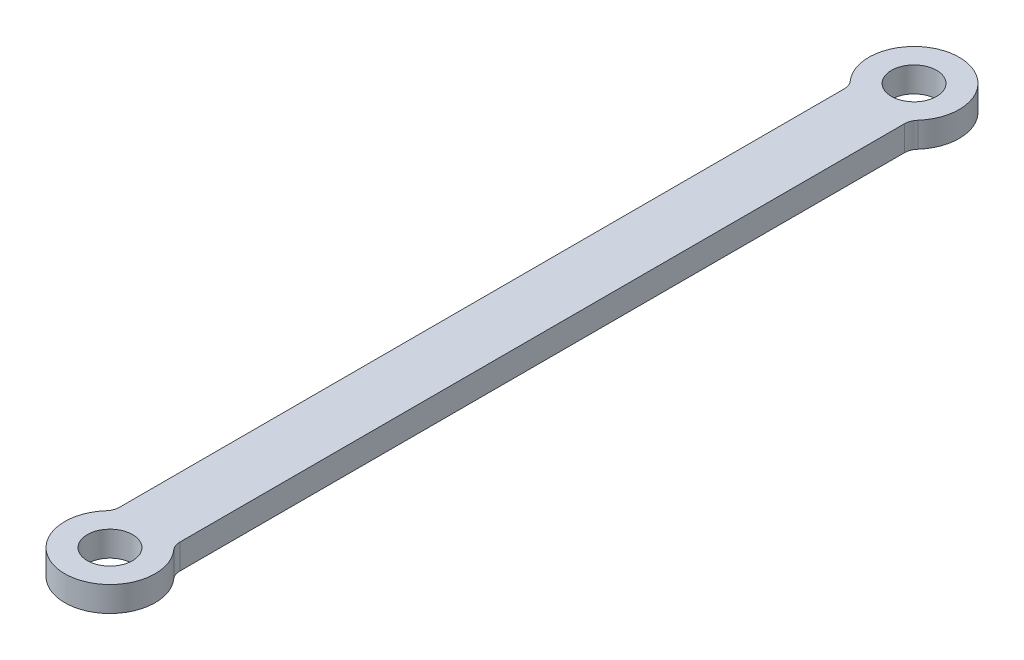
ISO-10303-21;
HEADER;
FILE_DESCRIPTION(('STEP AP214'),'2;1');
FILE_NAME('part.step','',(''),(''),'','','');
FILE_SCHEMA(('AUTOMOTIVE_DESIGN { 1 0 10303 214 1 1 1 1 }'));
ENDSEC;
DATA;
#1=APPLICATION_CONTEXT('core data for automotive mechanical design processes');
#2=APPLICATION_PROTOCOL_DEFINITION('international standard','automotive_design',2000,#1);
#3=PRODUCT_CONTEXT('',#1,'mechanical');
#4=PRODUCT('Part','Part','',(#3));
#5=PRODUCT_RELATED_PRODUCT_CATEGORY('part','',(#4));
#6=PRODUCT_DEFINITION_FORMATION('','',#4);
#7=PRODUCT_DEFINITION_CONTEXT('part definition',#1,'design');
#8=PRODUCT_DEFINITION('design','',#6,#7);
#9=PRODUCT_DEFINITION_SHAPE('','',#8);
#10=(LENGTH_UNIT() NAMED_UNIT(*) SI_UNIT(.MILLI.,.METRE.));
#11=(NAMED_UNIT(*) PLANE_ANGLE_UNIT() SI_UNIT($,.RADIAN.));
#12=(NAMED_UNIT(*) SI_UNIT($,.STERADIAN.) SOLID_ANGLE_UNIT());
#13=UNCERTAINTY_MEASURE_WITH_UNIT(LENGTH_MEASURE(1.E-05),#10,'distance_accuracy_value','');
#14=(GEOMETRIC_REPRESENTATION_CONTEXT(3) GLOBAL_UNCERTAINTY_ASSIGNED_CONTEXT((#13)) GLOBAL_UNIT_ASSIGNED_CONTEXT((#10,
#11,#12)) REPRESENTATION_CONTEXT('',''));
#15=CARTESIAN_POINT('',(0.,0.,0.));
#16=DIRECTION('',(0.,0.,1.));
#17=DIRECTION('',(1.,0.,0.));
#18=AXIS2_PLACEMENT_3D('',#15,#16,#17);
#19=CARTESIAN_POINT('',(-66.8897637795275,5.,106.393454728224));
#20=DIRECTION('',(0.,-1.,0.));
#21=DIRECTION('',(0.,0.,-1.));
#22=AXIS2_PLACEMENT_3D('',#19,#20,#21);
#23=PLANE('',#22);
#24=CARTESIAN_POINT('',(-66.8897637795275,5.,106.393454728224));
#25=DIRECTION('',(0.,-1.,0.));
#26=DIRECTION('',(0.,0.,-1.));
#27=AXIS2_PLACEMENT_3D('',#24,#25,#26);
#28=CIRCLE('',#27,3.);
#29=CARTESIAN_POINT('',(-69.1397637795275,5.,108.377768211522));
#30=VERTEX_POINT('',#29);
#31=CARTESIAN_POINT('',(-69.8897637795275,5.,106.393454728224));
#32=VERTEX_POINT('',#31);
#33=EDGE_CURVE('E164',#30,#32,#28,.T.);
#34=ORIENTED_EDGE('',*,*,#33,.T.);
#35=DIRECTION('',(0.,0.,-1.));
#36=VECTOR('',#35,1.);
#37=CARTESIAN_POINT('',(-69.8897637795275,5.,-37.7320374053889));
#38=LINE('',#37,#36);
#39=CARTESIAN_POINT('',(-69.8897637795275,5.,-37.7320374053889));
#40=VERTEX_POINT('',#39);
#41=EDGE_CURVE('E100',#32,#40,#38,.T.);
#42=ORIENTED_EDGE('',*,*,#41,.T.);
#43=CARTESIAN_POINT('',(-66.8897637795275,5.,-37.7320374053889));
#44=DIRECTION('',(0.,-1.,0.));
#45=DIRECTION('',(0.,0.,-1.));
#46=AXIS2_PLACEMENT_3D('',#43,#44,#45);
#47=CIRCLE('',#46,3.);
#48=CARTESIAN_POINT('',(-69.1397637795275,5.,-39.7163508886873));
#49=VERTEX_POINT('',#48);
#50=EDGE_CURVE('E185',#40,#49,#47,.T.);
#51=ORIENTED_EDGE('',*,*,#50,.T.);
#52=CARTESIAN_POINT('',(-75.8897637795275,5.,-45.6692913385827));
#53=DIRECTION('',(0.,1.,0.));
#54=DIRECTION('',(0.,0.,1.));
#55=AXIS2_PLACEMENT_3D('',#52,#53,#54);
#56=CIRCLE('',#55,8.99999999999999);
#57=CARTESIAN_POINT('',(-82.6397637795275,5.,-39.7163508886873));
#58=VERTEX_POINT('',#57);
#59=EDGE_CURVE('E199',#49,#58,#56,.T.);
#60=ORIENTED_EDGE('',*,*,#59,.T.);
#61=CARTESIAN_POINT('',(-84.8897637795275,5.,-37.7320374053888));
#62=DIRECTION('',(0.,-1.,0.));
#63=DIRECTION('',(0.,0.,1.));
#64=AXIS2_PLACEMENT_3D('',#61,#62,#63);
#65=CIRCLE('',#64,3.00000000000001);
#66=CARTESIAN_POINT('',(-81.8897637795275,5.,-37.7320374053888));
#67=VERTEX_POINT('',#66);
#68=EDGE_CURVE('E119',#58,#67,#65,.T.);
#69=ORIENTED_EDGE('',*,*,#68,.T.);
#70=DIRECTION('',(0.,0.,1.));
#71=VECTOR('',#70,1.);
#72=CARTESIAN_POINT('',(-81.8897637795275,5.,-37.7320374053888));
#73=LINE('',#72,#71);
#74=CARTESIAN_POINT('',(-81.8897637795259,5.,106.393454728222));
#75=VERTEX_POINT('',#74);
#76=EDGE_CURVE('E113',#67,#75,#73,.T.);
#77=ORIENTED_EDGE('',*,*,#76,.T.);
#78=CARTESIAN_POINT('',(-84.8897637795259,5.,106.393454728222));
#79=DIRECTION('',(0.,-1.,0.));
#80=DIRECTION('',(0.,0.,-1.));
#81=AXIS2_PLACEMENT_3D('',#78,#79,#80);
#82=CIRCLE('',#81,3.00000000000001);
#83=CARTESIAN_POINT('',(-82.6397637795263,5.,108.377768211521));
#84=VERTEX_POINT('',#83);
#85=EDGE_CURVE('E117',#75,#84,#82,.T.);
#86=ORIENTED_EDGE('',*,*,#85,.T.);
#87=CARTESIAN_POINT('',(-75.8897637795275,5.,114.330708661417));
#88=DIRECTION('',(0.,1.,0.));
#89=DIRECTION('',(0.,0.,1.));
#90=AXIS2_PLACEMENT_3D('',#87,#88,#89);
#91=CIRCLE('',#90,8.99999999999999);
#92=EDGE_CURVE('E57',#84,#30,#91,.T.);
#93=ORIENTED_EDGE('',*,*,#92,.T.);
#94=EDGE_LOOP('',(#34,#42,#51,#60,#69,#77,#86,#93));
#95=FACE_BOUND('',#94,.T.);
#96=CARTESIAN_POINT('',(-75.8897637795275,5.,-45.6692913385827));
#97=DIRECTION('',(0.,1.,0.));
#98=DIRECTION('',(0.,0.,1.));
#99=AXIS2_PLACEMENT_3D('',#96,#97,#98);
#100=CIRCLE('',#99,4.50000000000001);
#101=CARTESIAN_POINT('',(-75.8897637795275,5.,-41.1692913385827));
#102=VERTEX_POINT('',#101);
#103=EDGE_CURVE('E146',#102,#102,#100,.T.);
#104=ORIENTED_EDGE('',*,*,#103,.F.);
#105=EDGE_LOOP('',(#104));
#106=FACE_BOUND('',#105,.T.);
#107=CARTESIAN_POINT('',(-75.8897637795275,5.,114.330708661417));
#108=DIRECTION('',(0.,1.,0.));
#109=DIRECTION('',(0.,0.,1.));
#110=AXIS2_PLACEMENT_3D('',#107,#108,#109);
#111=CIRCLE('',#110,4.50000000000001);
#112=CARTESIAN_POINT('',(-75.8897637795275,5.,118.830708661417));
#113=VERTEX_POINT('',#112);
#114=EDGE_CURVE('E213',#113,#113,#111,.T.);
#115=ORIENTED_EDGE('',*,*,#114,.F.);
#116=EDGE_LOOP('',(#115));
#117=FACE_BOUND('',#116,.T.);
#118=ADVANCED_FACE('F39',(#95,#106,#117),#23,.F.);
#119=CARTESIAN_POINT('',(-66.8897637795275,0.,106.393454728224));
#120=DIRECTION('',(0.,-1.,0.));
#121=DIRECTION('',(0.,0.,-1.));
#122=AXIS2_PLACEMENT_3D('',#119,#120,#121);
#123=PLANE('',#122);
#124=CARTESIAN_POINT('',(-75.8897637795275,0.,-45.6692913385827));
#125=DIRECTION('',(0.,1.,0.));
#126=DIRECTION('',(0.,0.,1.));
#127=AXIS2_PLACEMENT_3D('',#124,#125,#126);
#128=CIRCLE('',#127,4.50000000000001);
#129=CARTESIAN_POINT('',(-75.8897637795275,0.,-41.1692913385827));
#130=VERTEX_POINT('',#129);
#131=EDGE_CURVE('E209',#130,#130,#128,.T.);
#132=ORIENTED_EDGE('',*,*,#131,.T.);
#133=EDGE_LOOP('',(#132));
#134=FACE_BOUND('',#133,.T.);
#135=CARTESIAN_POINT('',(-66.8897637795275,0.,106.393454728224));
#136=DIRECTION('',(0.,-1.,0.));
#137=DIRECTION('',(0.,0.,-1.));
#138=AXIS2_PLACEMENT_3D('',#135,#136,#137);
#139=CIRCLE('',#138,3.);
#140=CARTESIAN_POINT('',(-69.1397637795275,0.,108.377768211522));
#141=VERTEX_POINT('',#140);
#142=CARTESIAN_POINT('',(-69.8897637795275,0.,106.393454728224));
#143=VERTEX_POINT('',#142);
#144=EDGE_CURVE('E141',#141,#143,#139,.T.);
#145=ORIENTED_EDGE('',*,*,#144,.F.);
#146=CARTESIAN_POINT('',(-75.8897637795275,0.,114.330708661417));
#147=DIRECTION('',(0.,1.,0.));
#148=DIRECTION('',(0.,0.,1.));
#149=AXIS2_PLACEMENT_3D('',#146,#147,#148);
#150=CIRCLE('',#149,8.99999999999999);
#151=CARTESIAN_POINT('',(-82.6397637795263,0.,108.377768211521));
#152=VERTEX_POINT('',#151);
#153=EDGE_CURVE('E92',#152,#141,#150,.T.);
#154=ORIENTED_EDGE('',*,*,#153,.F.);
#155=CARTESIAN_POINT('',(-84.8897637795259,0.,106.393454728222));
#156=DIRECTION('',(0.,-1.,0.));
#157=DIRECTION('',(0.,0.,-1.));
#158=AXIS2_PLACEMENT_3D('',#155,#156,#157);
#159=CIRCLE('',#158,3.00000000000001);
#160=CARTESIAN_POINT('',(-81.8897637795259,0.,106.393454728222));
#161=VERTEX_POINT('',#160);
#162=EDGE_CURVE('E86',#161,#152,#159,.T.);
#163=ORIENTED_EDGE('',*,*,#162,.F.);
#164=DIRECTION('',(0.,0.,1.));
#165=VECTOR('',#164,1.);
#166=CARTESIAN_POINT('',(-81.8897637795275,0.,-37.7320374053888));
#167=LINE('',#166,#165);
#168=CARTESIAN_POINT('',(-81.8897637795275,0.,-37.7320374053888));
#169=VERTEX_POINT('',#168);
#170=EDGE_CURVE('E128',#169,#161,#167,.T.);
#171=ORIENTED_EDGE('',*,*,#170,.F.);
#172=CARTESIAN_POINT('',(-84.8897637795275,0.,-37.7320374053888));
#173=DIRECTION('',(0.,-1.,0.));
#174=DIRECTION('',(0.,0.,1.));
#175=AXIS2_PLACEMENT_3D('',#172,#173,#174);
#176=CIRCLE('',#175,3.00000000000001);
#177=CARTESIAN_POINT('',(-82.6397637795275,0.,-39.7163508886873));
#178=VERTEX_POINT('',#177);
#179=EDGE_CURVE('E155',#178,#169,#176,.T.);
#180=ORIENTED_EDGE('',*,*,#179,.F.);
#181=CARTESIAN_POINT('',(-75.8897637795275,0.,-45.6692913385827));
#182=DIRECTION('',(0.,1.,0.));
#183=DIRECTION('',(0.,0.,1.));
#184=AXIS2_PLACEMENT_3D('',#181,#182,#183);
#185=CIRCLE('',#184,8.99999999999999);
#186=CARTESIAN_POINT('',(-69.1397637795275,0.,-39.7163508886873));
#187=VERTEX_POINT('',#186);
#188=EDGE_CURVE('E152',#187,#178,#185,.T.);
#189=ORIENTED_EDGE('',*,*,#188,.F.);
#190=CARTESIAN_POINT('',(-66.8897637795275,0.,-37.7320374053889));
#191=DIRECTION('',(0.,-1.,0.));
#192=DIRECTION('',(0.,0.,-1.));
#193=AXIS2_PLACEMENT_3D('',#190,#191,#192);
#194=CIRCLE('',#193,3.);
#195=CARTESIAN_POINT('',(-69.8897637795275,0.,-37.7320374053889));
#196=VERTEX_POINT('',#195);
#197=EDGE_CURVE('E149',#196,#187,#194,.T.);
#198=ORIENTED_EDGE('',*,*,#197,.F.);
#199=DIRECTION('',(0.,0.,-1.));
#200=VECTOR('',#199,1.);
#201=CARTESIAN_POINT('',(-69.8897637795275,0.,-37.7320374053889));
#202=LINE('',#201,#200);
#203=EDGE_CURVE('E145',#143,#196,#202,.T.);
#204=ORIENTED_EDGE('',*,*,#203,.F.);
#205=EDGE_LOOP('',(#145,#154,#163,#171,#180,#189,#198,#204));
#206=FACE_BOUND('',#205,.T.);
#207=CARTESIAN_POINT('',(-75.8897637795275,0.,114.330708661417));
#208=DIRECTION('',(0.,1.,0.));
#209=DIRECTION('',(0.,0.,1.));
#210=AXIS2_PLACEMENT_3D('',#207,#208,#209);
#211=CIRCLE('',#210,4.50000000000001);
#212=CARTESIAN_POINT('',(-75.8897637795275,0.,118.830708661417));
#213=VERTEX_POINT('',#212);
#214=EDGE_CURVE('E217',#213,#213,#211,.T.);
#215=ORIENTED_EDGE('',*,*,#214,.T.);
#216=EDGE_LOOP('',(#215));
#217=FACE_BOUND('',#216,.T.);
#218=ADVANCED_FACE('F189',(#134,#206,#217),#123,.T.);
#219=CARTESIAN_POINT('',(-66.8897637795275,5.,106.393454728224));
#220=DIRECTION('',(0.,-1.,0.));
#221=DIRECTION('',(0.,0.,-1.));
#222=AXIS2_PLACEMENT_3D('',#219,#220,#221);
#223=CYLINDRICAL_SURFACE('',#222,3.);
#224=ORIENTED_EDGE('',*,*,#144,.T.);
#225=DIRECTION('',(0.,-1.,0.));
#226=VECTOR('',#225,1.);
#227=CARTESIAN_POINT('',(-69.8897637795275,5.,106.393454728224));
#228=LINE('',#227,#226);
#229=EDGE_CURVE('E11',#32,#143,#228,.T.);
#230=ORIENTED_EDGE('',*,*,#229,.F.);
#231=ORIENTED_EDGE('',*,*,#33,.F.);
#232=DIRECTION('',(0.,-1.,0.));
#233=VECTOR('',#232,1.);
#234=CARTESIAN_POINT('',(-69.1397637795275,5.,108.377768211522));
#235=LINE('',#234,#233);
#236=EDGE_CURVE('E137',#30,#141,#235,.T.);
#237=ORIENTED_EDGE('',*,*,#236,.T.);
#238=EDGE_LOOP('',(#224,#230,#231,#237));
#239=FACE_BOUND('',#238,.T.);
#240=ADVANCED_FACE('F41',(#239),#223,.F.);
#241=CARTESIAN_POINT('',(-69.8897637795275,5.,-37.7320374053889));
#242=DIRECTION('',(-1.,0.,0.));
#243=DIRECTION('',(0.,0.,1.));
#244=AXIS2_PLACEMENT_3D('',#241,#242,#243);
#245=PLANE('',#244);
#246=ORIENTED_EDGE('',*,*,#203,.T.);
#247=DIRECTION('',(0.,-1.,0.));
#248=VECTOR('',#247,1.);
#249=CARTESIAN_POINT('',(-69.8897637795275,5.,-37.7320374053889));
#250=LINE('',#249,#248);
#251=EDGE_CURVE('E49',#40,#196,#250,.T.);
#252=ORIENTED_EDGE('',*,*,#251,.F.);
#253=ORIENTED_EDGE('',*,*,#41,.F.);
#254=ORIENTED_EDGE('',*,*,#229,.T.);
#255=EDGE_LOOP('',(#246,#252,#253,#254));
#256=FACE_BOUND('',#255,.T.);
#257=ADVANCED_FACE('F251',(#256),#245,.F.);
#258=CARTESIAN_POINT('',(-66.8897637795275,5.,-37.7320374053889));
#259=DIRECTION('',(0.,-1.,0.));
#260=DIRECTION('',(0.,0.,-1.));
#261=AXIS2_PLACEMENT_3D('',#258,#259,#260);
#262=CYLINDRICAL_SURFACE('',#261,3.);
#263=ORIENTED_EDGE('',*,*,#197,.T.);
#264=DIRECTION('',(0.,-1.,0.));
#265=VECTOR('',#264,1.);
#266=CARTESIAN_POINT('',(-69.1397637795275,5.,-39.7163508886873));
#267=LINE('',#266,#265);
#268=EDGE_CURVE('E175',#49,#187,#267,.T.);
#269=ORIENTED_EDGE('',*,*,#268,.F.);
#270=ORIENTED_EDGE('',*,*,#50,.F.);
#271=ORIENTED_EDGE('',*,*,#251,.T.);
#272=EDGE_LOOP('',(#263,#269,#270,#271));
#273=FACE_BOUND('',#272,.T.);
#274=ADVANCED_FACE('F183',(#273),#262,.F.);
#275=CARTESIAN_POINT('',(-75.8897637795275,5.,-45.6692913385827));
#276=DIRECTION('',(0.,-1.,0.));
#277=DIRECTION('',(0.,0.,-1.));
#278=AXIS2_PLACEMENT_3D('',#275,#276,#277);
#279=CYLINDRICAL_SURFACE('',#278,8.99999999999999);
#280=ORIENTED_EDGE('',*,*,#188,.T.);
#281=DIRECTION('',(0.,-1.,0.));
#282=VECTOR('',#281,1.);
#283=CARTESIAN_POINT('',(-82.6397637795275,5.,-39.7163508886873));
#284=LINE('',#283,#282);
#285=EDGE_CURVE('E171',#58,#178,#284,.T.);
#286=ORIENTED_EDGE('',*,*,#285,.F.);
#287=ORIENTED_EDGE('',*,*,#59,.F.);
#288=ORIENTED_EDGE('',*,*,#268,.T.);
#289=EDGE_LOOP('',(#280,#286,#287,#288));
#290=FACE_BOUND('',#289,.T.);
#291=ADVANCED_FACE('F194',(#290),#279,.T.);
#292=CARTESIAN_POINT('',(-84.8897637795275,5.,-37.7320374053888));
#293=DIRECTION('',(0.,-1.,0.));
#294=DIRECTION('',(0.,0.,-1.));
#295=AXIS2_PLACEMENT_3D('',#292,#293,#294);
#296=CYLINDRICAL_SURFACE('',#295,3.00000000000001);
#297=ORIENTED_EDGE('',*,*,#179,.T.);
#298=DIRECTION('',(0.,-1.,0.));
#299=VECTOR('',#298,1.);
#300=CARTESIAN_POINT('',(-81.8897637795275,5.,-37.7320374053888));
#301=LINE('',#300,#299);
#302=EDGE_CURVE('E130',#67,#169,#301,.T.);
#303=ORIENTED_EDGE('',*,*,#302,.F.);
#304=ORIENTED_EDGE('',*,*,#68,.F.);
#305=ORIENTED_EDGE('',*,*,#285,.T.);
#306=EDGE_LOOP('',(#297,#303,#304,#305));
#307=FACE_BOUND('',#306,.T.);
#308=ADVANCED_FACE('F197',(#307),#296,.F.);
#309=CARTESIAN_POINT('',(-81.8897637795275,5.,-37.7320374053888));
#310=DIRECTION('',(1.,0.,0.));
#311=DIRECTION('',(0.,0.,-1.));
#312=AXIS2_PLACEMENT_3D('',#309,#310,#311);
#313=PLANE('',#312);
#314=ORIENTED_EDGE('',*,*,#170,.T.);
#315=DIRECTION('',(0.,-1.,0.));
#316=VECTOR('',#315,1.);
#317=CARTESIAN_POINT('',(-81.8897637795259,5.,106.393454728222));
#318=LINE('',#317,#316);
#319=EDGE_CURVE('E125',#75,#161,#318,.T.);
#320=ORIENTED_EDGE('',*,*,#319,.F.);
#321=ORIENTED_EDGE('',*,*,#76,.F.);
#322=ORIENTED_EDGE('',*,*,#302,.T.);
#323=EDGE_LOOP('',(#314,#320,#321,#322));
#324=FACE_BOUND('',#323,.T.);
#325=ADVANCED_FACE('F126',(#324),#313,.F.);
#326=CARTESIAN_POINT('',(-84.8897637795259,5.,106.393454728222));
#327=DIRECTION('',(0.,-1.,0.));
#328=DIRECTION('',(0.,0.,-1.));
#329=AXIS2_PLACEMENT_3D('',#326,#327,#328);
#330=CYLINDRICAL_SURFACE('',#329,3.00000000000001);
#331=ORIENTED_EDGE('',*,*,#162,.T.);
#332=DIRECTION('',(0.,-1.,0.));
#333=VECTOR('',#332,1.);
#334=CARTESIAN_POINT('',(-82.6397637795263,5.,108.377768211521));
#335=LINE('',#334,#333);
#336=EDGE_CURVE('E131',#84,#152,#335,.T.);
#337=ORIENTED_EDGE('',*,*,#336,.F.);
#338=ORIENTED_EDGE('',*,*,#85,.F.);
#339=ORIENTED_EDGE('',*,*,#319,.T.);
#340=EDGE_LOOP('',(#331,#337,#338,#339));
#341=FACE_BOUND('',#340,.T.);
#342=ADVANCED_FACE('F133',(#341),#330,.F.);
#343=CARTESIAN_POINT('',(-75.8897637795275,5.,114.330708661417));
#344=DIRECTION('',(0.,-1.,0.));
#345=DIRECTION('',(0.,0.,-1.));
#346=AXIS2_PLACEMENT_3D('',#343,#344,#345);
#347=CYLINDRICAL_SURFACE('',#346,8.99999999999999);
#348=ORIENTED_EDGE('',*,*,#153,.T.);
#349=ORIENTED_EDGE('',*,*,#236,.F.);
#350=ORIENTED_EDGE('',*,*,#92,.F.);
#351=ORIENTED_EDGE('',*,*,#336,.T.);
#352=EDGE_LOOP('',(#348,#349,#350,#351));
#353=FACE_BOUND('',#352,.T.);
#354=ADVANCED_FACE('F239',(#353),#347,.T.);
#355=CARTESIAN_POINT('',(-75.8897637795275,5.,-45.6692913385827));
#356=DIRECTION('',(0.,-1.,0.));
#357=DIRECTION('',(0.,0.,-1.));
#358=AXIS2_PLACEMENT_3D('',#355,#356,#357);
#359=CYLINDRICAL_SURFACE('',#358,4.50000000000001);
#360=ORIENTED_EDGE('',*,*,#103,.T.);
#361=EDGE_LOOP('',(#360));
#362=FACE_BOUND('',#361,.T.);
#363=ORIENTED_EDGE('',*,*,#131,.F.);
#364=EDGE_LOOP('',(#363));
#365=FACE_BOUND('',#364,.T.);
#366=ADVANCED_FACE('F236',(#362,#365),#359,.F.);
#367=CARTESIAN_POINT('',(-75.8897637795275,5.,114.330708661417));
#368=DIRECTION('',(0.,-1.,0.));
#369=DIRECTION('',(0.,0.,-1.));
#370=AXIS2_PLACEMENT_3D('',#367,#368,#369);
#371=CYLINDRICAL_SURFACE('',#370,4.50000000000001);
#372=ORIENTED_EDGE('',*,*,#114,.T.);
#373=EDGE_LOOP('',(#372));
#374=FACE_BOUND('',#373,.T.);
#375=ORIENTED_EDGE('',*,*,#214,.F.);
#376=EDGE_LOOP('',(#375));
#377=FACE_BOUND('',#376,.T.);
#378=ADVANCED_FACE('F225',(#374,#377),#371,.F.);
#379=CLOSED_SHELL('',(#118,#218,#240,#257,#274,#291,#308,#325,#342,#354,#366,#378));
#380=MANIFOLD_SOLID_BREP('B2',#379);
#381=ADVANCED_BREP_SHAPE_REPRESENTATION('',(#18,#380),#14);
#382=SHAPE_DEFINITION_REPRESENTATION(#9,#381);
ENDSEC;
END-ISO-10303-21;
